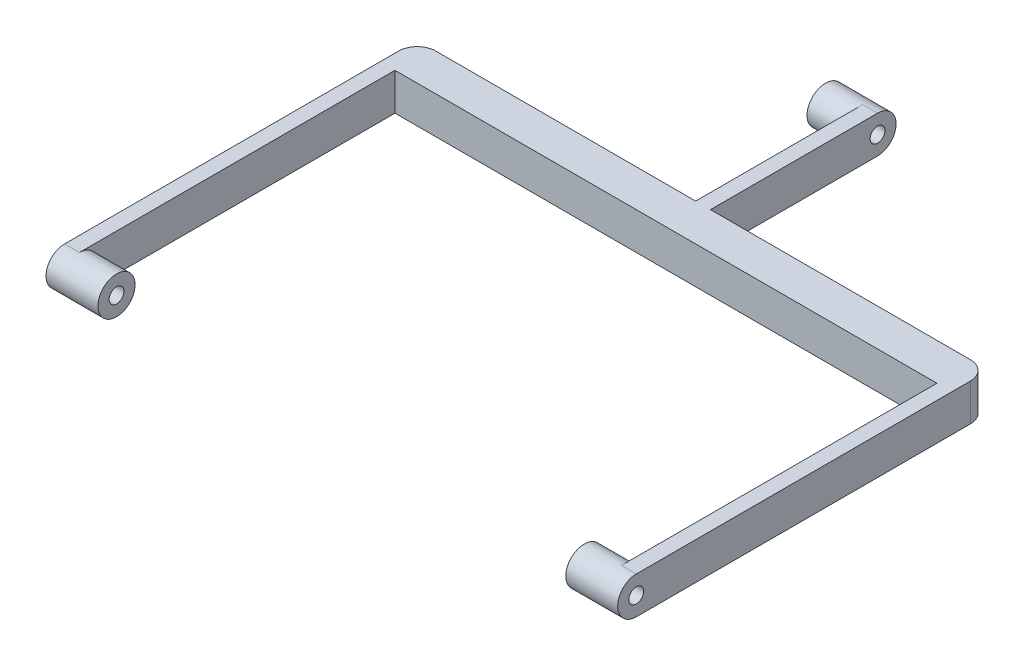
ISO-10303-21;
HEADER;
FILE_DESCRIPTION(('STEP AP214'),'2;1');
FILE_NAME('part.step','',(''),(''),'','','');
FILE_SCHEMA(('AUTOMOTIVE_DESIGN { 1 0 10303 214 1 1 1 1 }'));
ENDSEC;
DATA;
#1=APPLICATION_CONTEXT('core data for automotive mechanical design processes');
#2=APPLICATION_PROTOCOL_DEFINITION('international standard','automotive_design',2000,#1);
#3=PRODUCT_CONTEXT('',#1,'mechanical');
#4=PRODUCT('Part','Part','',(#3));
#5=PRODUCT_RELATED_PRODUCT_CATEGORY('part','',(#4));
#6=PRODUCT_DEFINITION_FORMATION('','',#4);
#7=PRODUCT_DEFINITION_CONTEXT('part definition',#1,'design');
#8=PRODUCT_DEFINITION('design','',#6,#7);
#9=PRODUCT_DEFINITION_SHAPE('','',#8);
#10=(LENGTH_UNIT() NAMED_UNIT(*) SI_UNIT(.MILLI.,.METRE.));
#11=(NAMED_UNIT(*) PLANE_ANGLE_UNIT() SI_UNIT($,.RADIAN.));
#12=(NAMED_UNIT(*) SI_UNIT($,.STERADIAN.) SOLID_ANGLE_UNIT());
#13=UNCERTAINTY_MEASURE_WITH_UNIT(LENGTH_MEASURE(1.E-05),#10,'distance_accuracy_value','');
#14=(GEOMETRIC_REPRESENTATION_CONTEXT(3) GLOBAL_UNCERTAINTY_ASSIGNED_CONTEXT((#13)) GLOBAL_UNIT_ASSIGNED_CONTEXT((#10,
#11,#12)) REPRESENTATION_CONTEXT('',''));
#15=CARTESIAN_POINT('',(0.,0.,0.));
#16=DIRECTION('',(0.,0.,1.));
#17=DIRECTION('',(1.,0.,0.));
#18=AXIS2_PLACEMENT_3D('',#15,#16,#17);
#19=CARTESIAN_POINT('',(-1.,0.,0.));
#20=DIRECTION('',(1.,0.,0.));
#21=DIRECTION('',(0.,0.,-1.));
#22=AXIS2_PLACEMENT_3D('',#19,#20,#21);
#23=PLANE('',#22);
#24=CARTESIAN_POINT('',(-1.,2.5,-25.));
#25=DIRECTION('',(-1.,0.,0.));
#26=DIRECTION('',(0.,0.,1.));
#27=AXIS2_PLACEMENT_3D('',#24,#25,#26);
#28=CIRCLE('',#27,2.5);
#29=CARTESIAN_POINT('',(-1.,0.,-25.));
#30=VERTEX_POINT('',#29);
#31=CARTESIAN_POINT('',(-1.,5.,-25.));
#32=VERTEX_POINT('',#31);
#33=EDGE_CURVE('E155',#30,#32,#28,.T.);
#34=ORIENTED_EDGE('',*,*,#33,.F.);
#35=DIRECTION('',(0.,0.,-1.));
#36=VECTOR('',#35,1.);
#37=CARTESIAN_POINT('',(-1.,0.,2.5));
#38=LINE('',#37,#36);
#39=CARTESIAN_POINT('',(-1.,0.,-2.5));
#40=VERTEX_POINT('',#39);
#41=EDGE_CURVE('E163',#40,#30,#38,.T.);
#42=ORIENTED_EDGE('',*,*,#41,.F.);
#43=DIRECTION('',(0.,1.,0.));
#44=VECTOR('',#43,1.);
#45=CARTESIAN_POINT('',(-1.,5.,-2.5));
#46=LINE('',#45,#44);
#47=CARTESIAN_POINT('',(-1.,5.,-2.5));
#48=VERTEX_POINT('',#47);
#49=EDGE_CURVE('E184',#40,#48,#46,.T.);
#50=ORIENTED_EDGE('',*,*,#49,.T.);
#51=DIRECTION('',(0.,0.,1.));
#52=VECTOR('',#51,1.);
#53=CARTESIAN_POINT('',(-1.,5.,2.5));
#54=LINE('',#53,#52);
#55=EDGE_CURVE('E169',#32,#48,#54,.T.);
#56=ORIENTED_EDGE('',*,*,#55,.F.);
#57=EDGE_LOOP('',(#34,#42,#50,#56));
#58=FACE_BOUND('',#57,.T.);
#59=ADVANCED_FACE('F33',(#58),#23,.F.);
#60=CARTESIAN_POINT('',(-38.5,5.,-2.5));
#61=DIRECTION('',(0.,0.,1.));
#62=DIRECTION('',(1.,0.,0.));
#63=AXIS2_PLACEMENT_3D('',#60,#61,#62);
#64=PLANE('',#63);
#65=ORIENTED_EDGE('',*,*,#49,.F.);
#66=DIRECTION('',(-1.,0.,0.));
#67=VECTOR('',#66,1.);
#68=CARTESIAN_POINT('',(-38.5,0.,-2.5));
#69=LINE('',#68,#67);
#70=CARTESIAN_POINT('',(-36.,0.,-2.5));
#71=VERTEX_POINT('',#70);
#72=EDGE_CURVE('E166',#40,#71,#69,.T.);
#73=ORIENTED_EDGE('',*,*,#72,.T.);
#74=DIRECTION('',(0.,-1.,0.));
#75=VECTOR('',#74,1.);
#76=CARTESIAN_POINT('',(-36.,5.,-2.5));
#77=LINE('',#76,#75);
#78=CARTESIAN_POINT('',(-36.,5.,-2.5));
#79=VERTEX_POINT('',#78);
#80=EDGE_CURVE('E270',#71,#79,#77,.F.);
#81=ORIENTED_EDGE('',*,*,#80,.T.);
#82=DIRECTION('',(-1.,0.,0.));
#83=VECTOR('',#82,1.);
#84=CARTESIAN_POINT('',(-38.5,5.,-2.5));
#85=LINE('',#84,#83);
#86=EDGE_CURVE('E232',#48,#79,#85,.T.);
#87=ORIENTED_EDGE('',*,*,#86,.F.);
#88=EDGE_LOOP('',(#65,#73,#81,#87));
#89=FACE_BOUND('',#88,.T.);
#90=ADVANCED_FACE('F350',(#89),#64,.F.);
#91=CARTESIAN_POINT('',(-36.5,5.,-2.5));
#92=DIRECTION('',(-1.,0.,0.));
#93=DIRECTION('',(0.,0.,1.));
#94=AXIS2_PLACEMENT_3D('',#91,#92,#93);
#95=PLANE('',#94);
#96=CARTESIAN_POINT('',(-36.5,2.5,45.));
#97=DIRECTION('',(1.,0.,0.));
#98=DIRECTION('',(0.,0.,-1.));
#99=AXIS2_PLACEMENT_3D('',#96,#97,#98);
#100=CIRCLE('',#99,2.5);
#101=CARTESIAN_POINT('',(-36.5,0.,45.));
#102=VERTEX_POINT('',#101);
#103=CARTESIAN_POINT('',(-36.5,5.,45.));
#104=VERTEX_POINT('',#103);
#105=EDGE_CURVE('E218',#102,#104,#100,.T.);
#106=ORIENTED_EDGE('',*,*,#105,.F.);
#107=DIRECTION('',(0.,0.,-1.));
#108=VECTOR('',#107,1.);
#109=CARTESIAN_POINT('',(-36.5,0.,-2.5));
#110=LINE('',#109,#108);
#111=CARTESIAN_POINT('',(-36.5,0.,2.5));
#112=VERTEX_POINT('',#111);
#113=EDGE_CURVE('E224',#102,#112,#110,.T.);
#114=ORIENTED_EDGE('',*,*,#113,.T.);
#115=DIRECTION('',(0.,1.,0.));
#116=VECTOR('',#115,1.);
#117=CARTESIAN_POINT('',(-36.5,5.,2.5));
#118=LINE('',#117,#116);
#119=CARTESIAN_POINT('',(-36.5,5.,2.5));
#120=VERTEX_POINT('',#119);
#121=EDGE_CURVE('E223',#112,#120,#118,.T.);
#122=ORIENTED_EDGE('',*,*,#121,.T.);
#123=DIRECTION('',(0.,0.,-1.));
#124=VECTOR('',#123,1.);
#125=CARTESIAN_POINT('',(-36.5,5.,-2.5));
#126=LINE('',#125,#124);
#127=EDGE_CURVE('E221',#104,#120,#126,.T.);
#128=ORIENTED_EDGE('',*,*,#127,.F.);
#129=EDGE_LOOP('',(#106,#114,#122,#128));
#130=FACE_BOUND('',#129,.T.);
#131=ADVANCED_FACE('F334',(#130),#95,.F.);
#132=CARTESIAN_POINT('',(-38.5,5.,2.5));
#133=DIRECTION('',(0.,0.,-1.));
#134=DIRECTION('',(-1.,0.,0.));
#135=AXIS2_PLACEMENT_3D('',#132,#133,#134);
#136=PLANE('',#135);
#137=DIRECTION('',(0.,1.,0.));
#138=VECTOR('',#137,1.);
#139=CARTESIAN_POINT('',(36.5,5.,2.5));
#140=LINE('',#139,#138);
#141=CARTESIAN_POINT('',(36.5,0.,2.5));
#142=VERTEX_POINT('',#141);
#143=CARTESIAN_POINT('',(36.5,5.,2.5));
#144=VERTEX_POINT('',#143);
#145=EDGE_CURVE('E204',#142,#144,#140,.T.);
#146=ORIENTED_EDGE('',*,*,#145,.T.);
#147=DIRECTION('',(1.,0.,0.));
#148=VECTOR('',#147,1.);
#149=CARTESIAN_POINT('',(-38.5,5.,2.5));
#150=LINE('',#149,#148);
#151=EDGE_CURVE('E239',#120,#144,#150,.T.);
#152=ORIENTED_EDGE('',*,*,#151,.F.);
#153=ORIENTED_EDGE('',*,*,#121,.F.);
#154=DIRECTION('',(1.,0.,0.));
#155=VECTOR('',#154,1.);
#156=CARTESIAN_POINT('',(-38.5,0.,2.5));
#157=LINE('',#156,#155);
#158=EDGE_CURVE('E233',#112,#142,#157,.T.);
#159=ORIENTED_EDGE('',*,*,#158,.T.);
#160=EDGE_LOOP('',(#146,#152,#153,#159));
#161=FACE_BOUND('',#160,.T.);
#162=ADVANCED_FACE('F327',(#161),#136,.F.);
#163=CARTESIAN_POINT('',(38.5,5.,2.5));
#164=DIRECTION('',(-1.,0.,0.));
#165=DIRECTION('',(0.,0.,1.));
#166=AXIS2_PLACEMENT_3D('',#163,#164,#165);
#167=PLANE('',#166);
#168=CARTESIAN_POINT('',(38.5,2.5,45.));
#169=DIRECTION('',(1.,0.,0.));
#170=DIRECTION('',(0.,0.,-1.));
#171=AXIS2_PLACEMENT_3D('',#168,#169,#170);
#172=CIRCLE('',#171,0.999999999999998);
#173=CARTESIAN_POINT('',(38.5,2.5,44.));
#174=VERTEX_POINT('',#173);
#175=EDGE_CURVE('E191',#174,#174,#172,.T.);
#176=ORIENTED_EDGE('',*,*,#175,.F.);
#177=EDGE_LOOP('',(#176));
#178=FACE_BOUND('',#177,.T.);
#179=DIRECTION('',(0.,0.,-1.));
#180=VECTOR('',#179,1.);
#181=CARTESIAN_POINT('',(38.5,0.,2.5));
#182=LINE('',#181,#180);
#183=CARTESIAN_POINT('',(38.5,0.,45.));
#184=VERTEX_POINT('',#183);
#185=CARTESIAN_POINT('',(38.5,0.,0.));
#186=VERTEX_POINT('',#185);
#187=EDGE_CURVE('E228',#184,#186,#182,.T.);
#188=ORIENTED_EDGE('',*,*,#187,.T.);
#189=DIRECTION('',(0.,-1.,0.));
#190=VECTOR('',#189,1.);
#191=CARTESIAN_POINT('',(38.5,5.,0.));
#192=LINE('',#191,#190);
#193=CARTESIAN_POINT('',(38.5,5.,0.));
#194=VERTEX_POINT('',#193);
#195=EDGE_CURVE('E283',#186,#194,#192,.F.);
#196=ORIENTED_EDGE('',*,*,#195,.T.);
#197=DIRECTION('',(0.,0.,-1.));
#198=VECTOR('',#197,1.);
#199=CARTESIAN_POINT('',(38.5,5.,2.5));
#200=LINE('',#199,#198);
#201=CARTESIAN_POINT('',(38.5,5.,45.));
#202=VERTEX_POINT('',#201);
#203=EDGE_CURVE('E229',#202,#194,#200,.T.);
#204=ORIENTED_EDGE('',*,*,#203,.F.);
#205=CARTESIAN_POINT('',(38.5,2.5,45.));
#206=DIRECTION('',(-1.,0.,0.));
#207=DIRECTION('',(0.,0.,1.));
#208=AXIS2_PLACEMENT_3D('',#205,#206,#207);
#209=CIRCLE('',#208,2.5);
#210=CARTESIAN_POINT('',(38.5,2.5,47.5));
#211=VERTEX_POINT('',#210);
#212=EDGE_CURVE('E264',#202,#211,#209,.F.);
#213=ORIENTED_EDGE('',*,*,#212,.T.);
#214=CARTESIAN_POINT('',(38.5,2.5,45.));
#215=DIRECTION('',(-1.,0.,0.));
#216=DIRECTION('',(0.,0.,1.));
#217=AXIS2_PLACEMENT_3D('',#214,#215,#216);
#218=CIRCLE('',#217,2.5);
#219=EDGE_CURVE('E266',#211,#184,#218,.F.);
#220=ORIENTED_EDGE('',*,*,#219,.T.);
#221=EDGE_LOOP('',(#188,#196,#204,#213,#220));
#222=FACE_BOUND('',#221,.T.);
#223=ADVANCED_FACE('F307',(#178,#222),#167,.F.);
#224=CARTESIAN_POINT('',(36.,0.,-2.5));
#225=VERTEX_POINT('',#224);
#226=CARTESIAN_POINT('',(1.,0.,-2.5));
#227=VERTEX_POINT('',#226);
#228=EDGE_CURVE('E244',#225,#227,#69,.T.);
#229=ORIENTED_EDGE('',*,*,#228,.T.);
#230=DIRECTION('',(0.,1.,0.));
#231=VECTOR('',#230,1.);
#232=CARTESIAN_POINT('',(1.,5.,-2.5));
#233=LINE('',#232,#231);
#234=CARTESIAN_POINT('',(1.,5.,-2.5));
#235=VERTEX_POINT('',#234);
#236=EDGE_CURVE('E188',#227,#235,#233,.T.);
#237=ORIENTED_EDGE('',*,*,#236,.T.);
#238=CARTESIAN_POINT('',(36.,5.,-2.5));
#239=VERTEX_POINT('',#238);
#240=EDGE_CURVE('E234',#239,#235,#85,.T.);
#241=ORIENTED_EDGE('',*,*,#240,.F.);
#242=DIRECTION('',(0.,-1.,0.));
#243=VECTOR('',#242,1.);
#244=CARTESIAN_POINT('',(36.,5.,-2.5));
#245=LINE('',#244,#243);
#246=EDGE_CURVE('E276',#239,#225,#245,.T.);
#247=ORIENTED_EDGE('',*,*,#246,.T.);
#248=EDGE_LOOP('',(#229,#237,#241,#247));
#249=FACE_BOUND('',#248,.T.);
#250=ADVANCED_FACE('F299',(#249),#64,.F.);
#251=CARTESIAN_POINT('',(-38.5,5.,2.5));
#252=DIRECTION('',(1.,0.,0.));
#253=DIRECTION('',(0.,0.,-1.));
#254=AXIS2_PLACEMENT_3D('',#251,#252,#253);
#255=PLANE('',#254);
#256=CARTESIAN_POINT('',(-38.5,2.5,45.));
#257=DIRECTION('',(1.,0.,0.));
#258=DIRECTION('',(0.,0.,-1.));
#259=AXIS2_PLACEMENT_3D('',#256,#257,#258);
#260=CIRCLE('',#259,0.999999999999998);
#261=CARTESIAN_POINT('',(-38.5,2.5,44.));
#262=VERTEX_POINT('',#261);
#263=EDGE_CURVE('E210',#262,#262,#260,.T.);
#264=ORIENTED_EDGE('',*,*,#263,.T.);
#265=EDGE_LOOP('',(#264));
#266=FACE_BOUND('',#265,.T.);
#267=DIRECTION('',(0.,0.,1.));
#268=VECTOR('',#267,1.);
#269=CARTESIAN_POINT('',(-38.5,5.,2.5));
#270=LINE('',#269,#268);
#271=CARTESIAN_POINT('',(-38.5,5.,0.));
#272=VERTEX_POINT('',#271);
#273=CARTESIAN_POINT('',(-38.5,5.,45.));
#274=VERTEX_POINT('',#273);
#275=EDGE_CURVE('E237',#272,#274,#270,.T.);
#276=ORIENTED_EDGE('',*,*,#275,.F.);
#277=DIRECTION('',(0.,-1.,0.));
#278=VECTOR('',#277,1.);
#279=CARTESIAN_POINT('',(-38.5,5.,0.));
#280=LINE('',#279,#278);
#281=CARTESIAN_POINT('',(-38.5,0.,0.));
#282=VERTEX_POINT('',#281);
#283=EDGE_CURVE('E159',#272,#282,#280,.T.);
#284=ORIENTED_EDGE('',*,*,#283,.T.);
#285=DIRECTION('',(0.,0.,1.));
#286=VECTOR('',#285,1.);
#287=CARTESIAN_POINT('',(-38.5,0.,2.5));
#288=LINE('',#287,#286);
#289=CARTESIAN_POINT('',(-38.5,0.,45.));
#290=VERTEX_POINT('',#289);
#291=EDGE_CURVE('E246',#282,#290,#288,.T.);
#292=ORIENTED_EDGE('',*,*,#291,.T.);
#293=CARTESIAN_POINT('',(-38.5,2.5,45.));
#294=DIRECTION('',(1.,0.,0.));
#295=DIRECTION('',(0.,0.,-1.));
#296=AXIS2_PLACEMENT_3D('',#293,#294,#295);
#297=CIRCLE('',#296,2.5);
#298=CARTESIAN_POINT('',(-38.5,2.5,47.5));
#299=VERTEX_POINT('',#298);
#300=EDGE_CURVE('E254',#290,#299,#297,.F.);
#301=ORIENTED_EDGE('',*,*,#300,.T.);
#302=CARTESIAN_POINT('',(-38.5,2.5,45.));
#303=DIRECTION('',(1.,0.,0.));
#304=DIRECTION('',(0.,0.,-1.));
#305=AXIS2_PLACEMENT_3D('',#302,#303,#304);
#306=CIRCLE('',#305,2.5);
#307=EDGE_CURVE('E251',#299,#274,#306,.F.);
#308=ORIENTED_EDGE('',*,*,#307,.T.);
#309=EDGE_LOOP('',(#276,#284,#292,#301,#308));
#310=FACE_BOUND('',#309,.T.);
#311=ADVANCED_FACE('F343',(#266,#310),#255,.F.);
#312=CARTESIAN_POINT('',(0.,5.,0.));
#313=DIRECTION('',(0.,-1.,0.));
#314=DIRECTION('',(0.,0.,-1.));
#315=AXIS2_PLACEMENT_3D('',#312,#313,#314);
#316=PLANE('',#315);
#317=DIRECTION('',(0.,0.,1.));
#318=VECTOR('',#317,1.);
#319=CARTESIAN_POINT('',(1.,5.,2.5));
#320=LINE('',#319,#318);
#321=CARTESIAN_POINT('',(1.,5.,-25.));
#322=VERTEX_POINT('',#321);
#323=EDGE_CURVE('E183',#322,#235,#320,.T.);
#324=ORIENTED_EDGE('',*,*,#323,.F.);
#325=DIRECTION('',(-1.,0.,0.));
#326=VECTOR('',#325,1.);
#327=CARTESIAN_POINT('',(0.,5.,-25.));
#328=LINE('',#327,#326);
#329=EDGE_CURVE('E11',#322,#32,#328,.T.);
#330=ORIENTED_EDGE('',*,*,#329,.T.);
#331=ORIENTED_EDGE('',*,*,#55,.T.);
#332=ORIENTED_EDGE('',*,*,#86,.T.);
#333=CARTESIAN_POINT('',(-36.,5.,0.));
#334=DIRECTION('',(0.,-1.,0.));
#335=DIRECTION('',(0.,0.,-1.));
#336=AXIS2_PLACEMENT_3D('',#333,#334,#335);
#337=CIRCLE('',#336,2.5);
#338=EDGE_CURVE('E285',#79,#272,#337,.F.);
#339=ORIENTED_EDGE('',*,*,#338,.T.);
#340=ORIENTED_EDGE('',*,*,#275,.T.);
#341=DIRECTION('',(1.,0.,0.));
#342=VECTOR('',#341,1.);
#343=CARTESIAN_POINT('',(0.,5.,45.));
#344=LINE('',#343,#342);
#345=EDGE_CURVE('E256',#274,#104,#344,.T.);
#346=ORIENTED_EDGE('',*,*,#345,.T.);
#347=ORIENTED_EDGE('',*,*,#127,.T.);
#348=ORIENTED_EDGE('',*,*,#151,.T.);
#349=DIRECTION('',(0.,0.,-1.));
#350=VECTOR('',#349,1.);
#351=CARTESIAN_POINT('',(36.5,5.,-2.5));
#352=LINE('',#351,#350);
#353=CARTESIAN_POINT('',(36.5,5.,45.));
#354=VERTEX_POINT('',#353);
#355=EDGE_CURVE('E201',#354,#144,#352,.T.);
#356=ORIENTED_EDGE('',*,*,#355,.F.);
#357=DIRECTION('',(-1.,0.,0.));
#358=VECTOR('',#357,1.);
#359=CARTESIAN_POINT('',(38.5,5.,45.));
#360=LINE('',#359,#358);
#361=EDGE_CURVE('E268',#354,#202,#360,.F.);
#362=ORIENTED_EDGE('',*,*,#361,.T.);
#363=ORIENTED_EDGE('',*,*,#203,.T.);
#364=CARTESIAN_POINT('',(36.,5.,0.));
#365=DIRECTION('',(0.,-1.,0.));
#366=DIRECTION('',(0.,0.,-1.));
#367=AXIS2_PLACEMENT_3D('',#364,#365,#366);
#368=CIRCLE('',#367,2.5);
#369=EDGE_CURVE('E287',#194,#239,#368,.F.);
#370=ORIENTED_EDGE('',*,*,#369,.T.);
#371=ORIENTED_EDGE('',*,*,#240,.T.);
#372=EDGE_LOOP('',(#324,#330,#331,#332,#339,#340,#346,#347,#348,#356,#362,#363,#370,#371));
#373=FACE_BOUND('',#372,.T.);
#374=ADVANCED_FACE('F293',(#373),#316,.F.);
#375=CARTESIAN_POINT('',(0.,0.,0.));
#376=DIRECTION('',(0.,-1.,0.));
#377=DIRECTION('',(0.,0.,-1.));
#378=AXIS2_PLACEMENT_3D('',#375,#376,#377);
#379=PLANE('',#378);
#380=ORIENTED_EDGE('',*,*,#41,.T.);
#381=DIRECTION('',(-1.,0.,0.));
#382=VECTOR('',#381,1.);
#383=CARTESIAN_POINT('',(1.,0.,-25.));
#384=LINE('',#383,#382);
#385=CARTESIAN_POINT('',(1.,0.,-25.));
#386=VERTEX_POINT('',#385);
#387=EDGE_CURVE('E150',#30,#386,#384,.F.);
#388=ORIENTED_EDGE('',*,*,#387,.T.);
#389=DIRECTION('',(0.,0.,-1.));
#390=VECTOR('',#389,1.);
#391=CARTESIAN_POINT('',(1.,0.,2.5));
#392=LINE('',#391,#390);
#393=EDGE_CURVE('E181',#227,#386,#392,.T.);
#394=ORIENTED_EDGE('',*,*,#393,.F.);
#395=ORIENTED_EDGE('',*,*,#228,.F.);
#396=CARTESIAN_POINT('',(36.,0.,0.));
#397=DIRECTION('',(0.,-1.,0.));
#398=DIRECTION('',(0.,0.,-1.));
#399=AXIS2_PLACEMENT_3D('',#396,#397,#398);
#400=CIRCLE('',#399,2.5);
#401=EDGE_CURVE('E281',#225,#186,#400,.T.);
#402=ORIENTED_EDGE('',*,*,#401,.T.);
#403=ORIENTED_EDGE('',*,*,#187,.F.);
#404=DIRECTION('',(-1.,0.,0.));
#405=VECTOR('',#404,1.);
#406=CARTESIAN_POINT('',(0.,0.,45.));
#407=LINE('',#406,#405);
#408=CARTESIAN_POINT('',(36.5,0.,45.));
#409=VERTEX_POINT('',#408);
#410=EDGE_CURVE('E258',#184,#409,#407,.T.);
#411=ORIENTED_EDGE('',*,*,#410,.T.);
#412=DIRECTION('',(0.,0.,-1.));
#413=VECTOR('',#412,1.);
#414=CARTESIAN_POINT('',(36.5,0.,-2.5));
#415=LINE('',#414,#413);
#416=EDGE_CURVE('E205',#409,#142,#415,.T.);
#417=ORIENTED_EDGE('',*,*,#416,.T.);
#418=ORIENTED_EDGE('',*,*,#158,.F.);
#419=ORIENTED_EDGE('',*,*,#113,.F.);
#420=DIRECTION('',(1.,0.,0.));
#421=VECTOR('',#420,1.);
#422=CARTESIAN_POINT('',(-38.5,0.,45.));
#423=LINE('',#422,#421);
#424=EDGE_CURVE('E241',#102,#290,#423,.F.);
#425=ORIENTED_EDGE('',*,*,#424,.T.);
#426=ORIENTED_EDGE('',*,*,#291,.F.);
#427=CARTESIAN_POINT('',(-36.,0.,0.));
#428=DIRECTION('',(0.,-1.,0.));
#429=DIRECTION('',(0.,0.,-1.));
#430=AXIS2_PLACEMENT_3D('',#427,#428,#429);
#431=CIRCLE('',#430,2.5);
#432=EDGE_CURVE('E279',#282,#71,#431,.T.);
#433=ORIENTED_EDGE('',*,*,#432,.T.);
#434=ORIENTED_EDGE('',*,*,#72,.F.);
#435=EDGE_LOOP('',(#380,#388,#394,#395,#402,#403,#411,#417,#418,#419,#425,#426,#433,#434));
#436=FACE_BOUND('',#435,.T.);
#437=ADVANCED_FACE('F164',(#436),#379,.T.);
#438=CARTESIAN_POINT('',(0.,2.5,45.));
#439=DIRECTION('',(1.,0.,0.));
#440=DIRECTION('',(0.,0.,-1.));
#441=AXIS2_PLACEMENT_3D('',#438,#439,#440);
#442=CYLINDRICAL_SURFACE('',#441,2.5);
#443=ORIENTED_EDGE('',*,*,#345,.F.);
#444=ORIENTED_EDGE('',*,*,#307,.F.);
#445=DIRECTION('',(1.,0.,0.));
#446=VECTOR('',#445,1.);
#447=CARTESIAN_POINT('',(-38.5,2.5,47.5));
#448=LINE('',#447,#446);
#449=CARTESIAN_POINT('',(-36.5,2.5,47.5));
#450=VERTEX_POINT('',#449);
#451=EDGE_CURVE('E217',#450,#299,#448,.F.);
#452=ORIENTED_EDGE('',*,*,#451,.F.);
#453=ORIENTED_EDGE('',*,*,#451,.T.);
#454=ORIENTED_EDGE('',*,*,#300,.F.);
#455=ORIENTED_EDGE('',*,*,#424,.F.);
#456=ORIENTED_EDGE('',*,*,#105,.T.);
#457=EDGE_LOOP('',(#443,#444,#452,#453,#454,#455,#456));
#458=FACE_BOUND('',#457,.T.);
#459=CARTESIAN_POINT('',(-31.5,2.5,45.));
#460=DIRECTION('',(1.,0.,0.));
#461=DIRECTION('',(0.,0.,-1.));
#462=AXIS2_PLACEMENT_3D('',#459,#460,#461);
#463=CIRCLE('',#462,2.5);
#464=CARTESIAN_POINT('',(-31.5,2.5,42.5));
#465=VERTEX_POINT('',#464);
#466=EDGE_CURVE('E214',#465,#465,#463,.T.);
#467=ORIENTED_EDGE('',*,*,#466,.F.);
#468=EDGE_LOOP('',(#467));
#469=FACE_BOUND('',#468,.T.);
#470=ADVANCED_FACE('F337',(#458,#469),#442,.T.);
#471=CARTESIAN_POINT('',(-31.5,2.5,45.));
#472=DIRECTION('',(1.,0.,0.));
#473=DIRECTION('',(0.,0.,-1.));
#474=AXIS2_PLACEMENT_3D('',#471,#472,#473);
#475=PLANE('',#474);
#476=CARTESIAN_POINT('',(-31.5,2.5,45.));
#477=DIRECTION('',(1.,0.,0.));
#478=DIRECTION('',(0.,0.,-1.));
#479=AXIS2_PLACEMENT_3D('',#476,#477,#478);
#480=CIRCLE('',#479,0.999999999999998);
#481=CARTESIAN_POINT('',(-31.5,2.5,44.));
#482=VERTEX_POINT('',#481);
#483=EDGE_CURVE('E213',#482,#482,#480,.T.);
#484=ORIENTED_EDGE('',*,*,#483,.F.);
#485=EDGE_LOOP('',(#484));
#486=FACE_BOUND('',#485,.T.);
#487=ORIENTED_EDGE('',*,*,#466,.T.);
#488=EDGE_LOOP('',(#487));
#489=FACE_BOUND('',#488,.T.);
#490=ADVANCED_FACE('F376',(#486,#489),#475,.T.);
#491=CARTESIAN_POINT('',(-38.5,2.5,45.));
#492=DIRECTION('',(1.,0.,0.));
#493=DIRECTION('',(0.,0.,-1.));
#494=AXIS2_PLACEMENT_3D('',#491,#492,#493);
#495=CYLINDRICAL_SURFACE('',#494,0.999999999999998);
#496=ORIENTED_EDGE('',*,*,#483,.T.);
#497=EDGE_LOOP('',(#496));
#498=FACE_BOUND('',#497,.T.);
#499=ORIENTED_EDGE('',*,*,#263,.F.);
#500=EDGE_LOOP('',(#499));
#501=FACE_BOUND('',#500,.T.);
#502=ADVANCED_FACE('F404',(#498,#501),#495,.F.);
#503=CARTESIAN_POINT('',(36.5,5.,-2.5));
#504=DIRECTION('',(-1.,0.,0.));
#505=DIRECTION('',(0.,0.,1.));
#506=AXIS2_PLACEMENT_3D('',#503,#504,#505);
#507=PLANE('',#506);
#508=CARTESIAN_POINT('',(36.5,2.5,45.));
#509=DIRECTION('',(1.,0.,0.));
#510=DIRECTION('',(0.,0.,-1.));
#511=AXIS2_PLACEMENT_3D('',#508,#509,#510);
#512=CIRCLE('',#511,2.5);
#513=EDGE_CURVE('E199',#409,#354,#512,.T.);
#514=ORIENTED_EDGE('',*,*,#513,.T.);
#515=ORIENTED_EDGE('',*,*,#355,.T.);
#516=ORIENTED_EDGE('',*,*,#145,.F.);
#517=ORIENTED_EDGE('',*,*,#416,.F.);
#518=EDGE_LOOP('',(#514,#515,#516,#517));
#519=FACE_BOUND('',#518,.T.);
#520=ADVANCED_FACE('F324',(#519),#507,.T.);
#521=CARTESIAN_POINT('',(38.5,2.5,45.));
#522=DIRECTION('',(1.,0.,0.));
#523=DIRECTION('',(0.,0.,-1.));
#524=AXIS2_PLACEMENT_3D('',#521,#522,#523);
#525=CYLINDRICAL_SURFACE('',#524,2.5);
#526=DIRECTION('',(-1.,0.,0.));
#527=VECTOR('',#526,1.);
#528=CARTESIAN_POINT('',(36.5,2.5,47.5));
#529=LINE('',#528,#527);
#530=CARTESIAN_POINT('',(36.5,2.5,47.5));
#531=VERTEX_POINT('',#530);
#532=EDGE_CURVE('E198',#211,#531,#529,.T.);
#533=ORIENTED_EDGE('',*,*,#532,.F.);
#534=ORIENTED_EDGE('',*,*,#212,.F.);
#535=ORIENTED_EDGE('',*,*,#361,.F.);
#536=ORIENTED_EDGE('',*,*,#513,.F.);
#537=ORIENTED_EDGE('',*,*,#410,.F.);
#538=ORIENTED_EDGE('',*,*,#219,.F.);
#539=ORIENTED_EDGE('',*,*,#532,.T.);
#540=EDGE_LOOP('',(#533,#534,#535,#536,#537,#538,#539));
#541=FACE_BOUND('',#540,.T.);
#542=CARTESIAN_POINT('',(31.5,2.5,45.));
#543=DIRECTION('',(1.,0.,0.));
#544=DIRECTION('',(0.,0.,-1.));
#545=AXIS2_PLACEMENT_3D('',#542,#543,#544);
#546=CIRCLE('',#545,2.5);
#547=CARTESIAN_POINT('',(31.5,2.5,42.5));
#548=VERTEX_POINT('',#547);
#549=EDGE_CURVE('E195',#548,#548,#546,.T.);
#550=ORIENTED_EDGE('',*,*,#549,.T.);
#551=EDGE_LOOP('',(#550));
#552=FACE_BOUND('',#551,.T.);
#553=ADVANCED_FACE('F317',(#541,#552),#525,.T.);
#554=CARTESIAN_POINT('',(31.5,2.5,45.));
#555=DIRECTION('',(-1.,0.,0.));
#556=DIRECTION('',(0.,0.,-1.));
#557=AXIS2_PLACEMENT_3D('',#554,#555,#556);
#558=PLANE('',#557);
#559=CARTESIAN_POINT('',(31.5,2.5,45.));
#560=DIRECTION('',(-1.,0.,0.));
#561=DIRECTION('',(0.,0.,1.));
#562=AXIS2_PLACEMENT_3D('',#559,#560,#561);
#563=CIRCLE('',#562,0.999999999999998);
#564=CARTESIAN_POINT('',(31.5,2.5,46.));
#565=VERTEX_POINT('',#564);
#566=EDGE_CURVE('E194',#565,#565,#563,.F.);
#567=ORIENTED_EDGE('',*,*,#566,.T.);
#568=EDGE_LOOP('',(#567));
#569=FACE_BOUND('',#568,.T.);
#570=ORIENTED_EDGE('',*,*,#549,.F.);
#571=EDGE_LOOP('',(#570));
#572=FACE_BOUND('',#571,.T.);
#573=ADVANCED_FACE('F379',(#569,#572),#558,.T.);
#574=CARTESIAN_POINT('',(38.5,2.5,45.));
#575=DIRECTION('',(-1.,0.,0.));
#576=DIRECTION('',(0.,0.,1.));
#577=AXIS2_PLACEMENT_3D('',#574,#575,#576);
#578=CYLINDRICAL_SURFACE('',#577,0.999999999999998);
#579=ORIENTED_EDGE('',*,*,#566,.F.);
#580=EDGE_LOOP('',(#579));
#581=FACE_BOUND('',#580,.T.);
#582=ORIENTED_EDGE('',*,*,#175,.T.);
#583=EDGE_LOOP('',(#582));
#584=FACE_BOUND('',#583,.T.);
#585=ADVANCED_FACE('F381',(#581,#584),#578,.F.);
#586=CARTESIAN_POINT('',(36.,5.,0.));
#587=DIRECTION('',(0.,-1.,0.));
#588=DIRECTION('',(0.,0.,-1.));
#589=AXIS2_PLACEMENT_3D('',#586,#587,#588);
#590=CYLINDRICAL_SURFACE('',#589,2.5);
#591=ORIENTED_EDGE('',*,*,#369,.F.);
#592=ORIENTED_EDGE('',*,*,#195,.F.);
#593=ORIENTED_EDGE('',*,*,#401,.F.);
#594=ORIENTED_EDGE('',*,*,#246,.F.);
#595=EDGE_LOOP('',(#591,#592,#593,#594));
#596=FACE_BOUND('',#595,.T.);
#597=ADVANCED_FACE('F311',(#596),#590,.T.);
#598=CARTESIAN_POINT('',(-36.,5.,0.));
#599=DIRECTION('',(0.,-1.,0.));
#600=DIRECTION('',(0.,0.,-1.));
#601=AXIS2_PLACEMENT_3D('',#598,#599,#600);
#602=CYLINDRICAL_SURFACE('',#601,2.5);
#603=ORIENTED_EDGE('',*,*,#338,.F.);
#604=ORIENTED_EDGE('',*,*,#80,.F.);
#605=ORIENTED_EDGE('',*,*,#432,.F.);
#606=ORIENTED_EDGE('',*,*,#283,.F.);
#607=EDGE_LOOP('',(#603,#604,#605,#606));
#608=FACE_BOUND('',#607,.T.);
#609=ADVANCED_FACE('F348',(#608),#602,.T.);
#610=CARTESIAN_POINT('',(1.,0.,0.));
#611=DIRECTION('',(1.,0.,0.));
#612=DIRECTION('',(0.,0.,-1.));
#613=AXIS2_PLACEMENT_3D('',#610,#611,#612);
#614=PLANE('',#613);
#615=CARTESIAN_POINT('',(1.,2.5,-25.));
#616=DIRECTION('',(1.,0.,0.));
#617=DIRECTION('',(0.,0.,-1.));
#618=AXIS2_PLACEMENT_3D('',#615,#616,#617);
#619=CIRCLE('',#618,1.00000000000001);
#620=CARTESIAN_POINT('',(1.,2.5,-26.));
#621=VERTEX_POINT('',#620);
#622=EDGE_CURVE('E174',#621,#621,#619,.T.);
#623=ORIENTED_EDGE('',*,*,#622,.F.);
#624=EDGE_LOOP('',(#623));
#625=FACE_BOUND('',#624,.T.);
#626=ORIENTED_EDGE('',*,*,#393,.T.);
#627=CARTESIAN_POINT('',(1.,2.5,-25.));
#628=DIRECTION('',(1.,0.,0.));
#629=DIRECTION('',(0.,0.,-1.));
#630=AXIS2_PLACEMENT_3D('',#627,#628,#629);
#631=CIRCLE('',#630,2.5);
#632=CARTESIAN_POINT('',(1.,2.5,-27.5));
#633=VERTEX_POINT('',#632);
#634=EDGE_CURVE('E42',#386,#633,#631,.T.);
#635=ORIENTED_EDGE('',*,*,#634,.T.);
#636=CARTESIAN_POINT('',(1.,2.5,-25.));
#637=DIRECTION('',(1.,0.,0.));
#638=DIRECTION('',(0.,0.,-1.));
#639=AXIS2_PLACEMENT_3D('',#636,#637,#638);
#640=CIRCLE('',#639,2.5);
#641=EDGE_CURVE('E50',#633,#322,#640,.T.);
#642=ORIENTED_EDGE('',*,*,#641,.T.);
#643=ORIENTED_EDGE('',*,*,#323,.T.);
#644=ORIENTED_EDGE('',*,*,#236,.F.);
#645=EDGE_LOOP('',(#626,#635,#642,#643,#644));
#646=FACE_BOUND('',#645,.T.);
#647=ADVANCED_FACE('F297',(#625,#646),#614,.T.);
#648=CARTESIAN_POINT('',(0.,2.5,-25.));
#649=DIRECTION('',(-1.,0.,0.));
#650=DIRECTION('',(0.,0.,1.));
#651=AXIS2_PLACEMENT_3D('',#648,#649,#650);
#652=CYLINDRICAL_SURFACE('',#651,2.5);
#653=ORIENTED_EDGE('',*,*,#329,.F.);
#654=ORIENTED_EDGE('',*,*,#641,.F.);
#655=DIRECTION('',(-1.,0.,0.));
#656=VECTOR('',#655,1.);
#657=CARTESIAN_POINT('',(1.,2.5,-27.5));
#658=LINE('',#657,#656);
#659=CARTESIAN_POINT('',(-1.,2.5,-27.5));
#660=VERTEX_POINT('',#659);
#661=EDGE_CURVE('E170',#660,#633,#658,.F.);
#662=ORIENTED_EDGE('',*,*,#661,.F.);
#663=ORIENTED_EDGE('',*,*,#661,.T.);
#664=ORIENTED_EDGE('',*,*,#634,.F.);
#665=ORIENTED_EDGE('',*,*,#387,.F.);
#666=ORIENTED_EDGE('',*,*,#33,.T.);
#667=EDGE_LOOP('',(#653,#654,#662,#663,#664,#665,#666));
#668=FACE_BOUND('',#667,.T.);
#669=CARTESIAN_POINT('',(-6.,2.5,-25.));
#670=DIRECTION('',(-1.,0.,0.));
#671=DIRECTION('',(0.,0.,1.));
#672=AXIS2_PLACEMENT_3D('',#669,#670,#671);
#673=CIRCLE('',#672,2.5);
#674=CARTESIAN_POINT('',(-6.,2.5,-22.5));
#675=VERTEX_POINT('',#674);
#676=EDGE_CURVE('E173',#675,#675,#673,.T.);
#677=ORIENTED_EDGE('',*,*,#676,.F.);
#678=EDGE_LOOP('',(#677));
#679=FACE_BOUND('',#678,.T.);
#680=ADVANCED_FACE('F35',(#668,#679),#652,.T.);
#681=CARTESIAN_POINT('',(-6.,2.5,-25.));
#682=DIRECTION('',(-1.,0.,0.));
#683=DIRECTION('',(0.,0.,1.));
#684=AXIS2_PLACEMENT_3D('',#681,#682,#683);
#685=PLANE('',#684);
#686=CARTESIAN_POINT('',(-6.,2.5,-25.));
#687=DIRECTION('',(-1.,0.,0.));
#688=DIRECTION('',(0.,0.,1.));
#689=AXIS2_PLACEMENT_3D('',#686,#687,#688);
#690=CIRCLE('',#689,1.00000000000001);
#691=CARTESIAN_POINT('',(-6.,2.5,-24.));
#692=VERTEX_POINT('',#691);
#693=EDGE_CURVE('E37',#692,#692,#690,.T.);
#694=ORIENTED_EDGE('',*,*,#693,.F.);
#695=EDGE_LOOP('',(#694));
#696=FACE_BOUND('',#695,.T.);
#697=ORIENTED_EDGE('',*,*,#676,.T.);
#698=EDGE_LOOP('',(#697));
#699=FACE_BOUND('',#698,.T.);
#700=ADVANCED_FACE('F391',(#696,#699),#685,.T.);
#701=CARTESIAN_POINT('',(-38.5,2.5,-25.));
#702=DIRECTION('',(1.,0.,0.));
#703=DIRECTION('',(0.,0.,-1.));
#704=AXIS2_PLACEMENT_3D('',#701,#702,#703);
#705=CYLINDRICAL_SURFACE('',#704,1.00000000000001);
#706=ORIENTED_EDGE('',*,*,#622,.T.);
#707=EDGE_LOOP('',(#706));
#708=FACE_BOUND('',#707,.T.);
#709=ORIENTED_EDGE('',*,*,#693,.T.);
#710=EDGE_LOOP('',(#709));
#711=FACE_BOUND('',#710,.T.);
#712=ADVANCED_FACE('F556',(#708,#711),#705,.F.);
#713=CLOSED_SHELL('',(#59,#90,#131,#162,#223,#250,#311,#374,#437,#470,#490,#502,#520,#553,#573,
#585,#597,#609,#647,#680,#700,#712));
#714=MANIFOLD_SOLID_BREP('B2',#713);
#715=ADVANCED_BREP_SHAPE_REPRESENTATION('',(#18,#714),#14);
#716=SHAPE_DEFINITION_REPRESENTATION(#9,#715);
ENDSEC;
END-ISO-10303-21;
